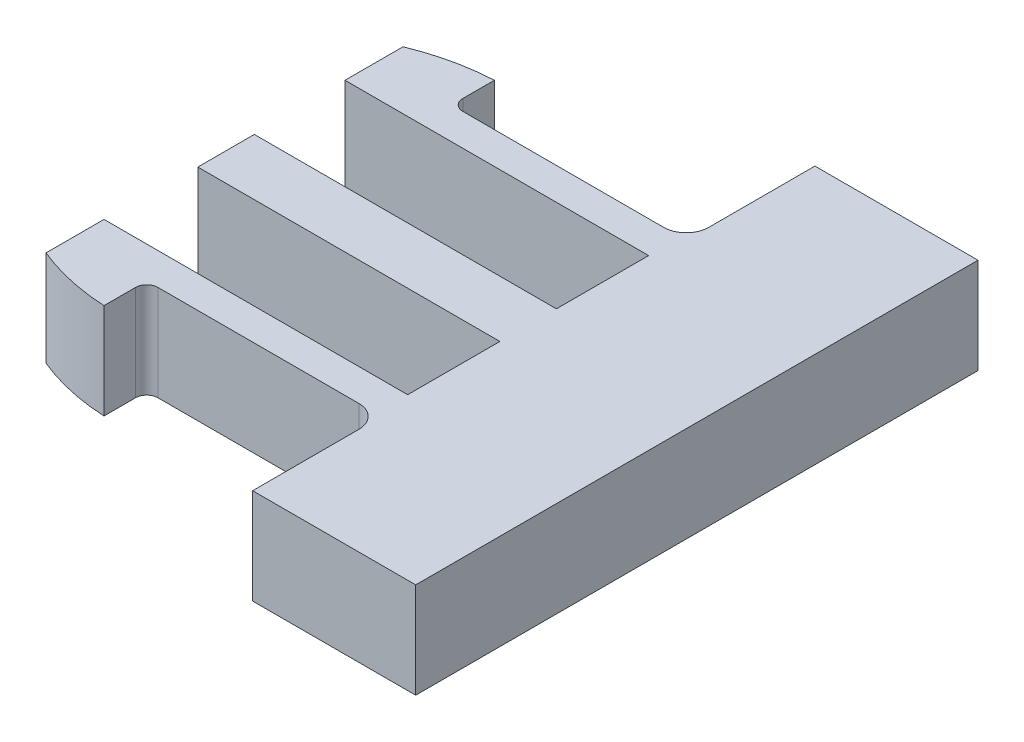
ISO-10303-21;
HEADER;
FILE_DESCRIPTION(('STEP AP214'),'2;1');
FILE_NAME('part.step','',(''),(''),'','','');
FILE_SCHEMA(('AUTOMOTIVE_DESIGN { 1 0 10303 214 1 1 1 1 }'));
ENDSEC;
DATA;
#1=APPLICATION_CONTEXT('core data for automotive mechanical design processes');
#2=APPLICATION_PROTOCOL_DEFINITION('international standard','automotive_design',2000,#1);
#3=PRODUCT_CONTEXT('',#1,'mechanical');
#4=PRODUCT('Part','Part','',(#3));
#5=PRODUCT_RELATED_PRODUCT_CATEGORY('part','',(#4));
#6=PRODUCT_DEFINITION_FORMATION('','',#4);
#7=PRODUCT_DEFINITION_CONTEXT('part definition',#1,'design');
#8=PRODUCT_DEFINITION('design','',#6,#7);
#9=PRODUCT_DEFINITION_SHAPE('','',#8);
#10=(LENGTH_UNIT() NAMED_UNIT(*) SI_UNIT(.MILLI.,.METRE.));
#11=(NAMED_UNIT(*) PLANE_ANGLE_UNIT() SI_UNIT($,.RADIAN.));
#12=(NAMED_UNIT(*) SI_UNIT($,.STERADIAN.) SOLID_ANGLE_UNIT());
#13=UNCERTAINTY_MEASURE_WITH_UNIT(LENGTH_MEASURE(1.E-05),#10,'distance_accuracy_value','');
#14=(GEOMETRIC_REPRESENTATION_CONTEXT(3) GLOBAL_UNCERTAINTY_ASSIGNED_CONTEXT((#13)) GLOBAL_UNIT_ASSIGNED_CONTEXT((#10,
#11,#12)) REPRESENTATION_CONTEXT('',''));
#15=CARTESIAN_POINT('',(0.,0.,0.));
#16=DIRECTION('',(0.,0.,1.));
#17=DIRECTION('',(1.,0.,0.));
#18=AXIS2_PLACEMENT_3D('',#15,#16,#17);
#19=CARTESIAN_POINT('',(0.,8.5,-10.7145111342555));
#20=DIRECTION('',(0.,0.,-1.));
#21=DIRECTION('',(-1.,0.,0.));
#22=AXIS2_PLACEMENT_3D('',#19,#20,#21);
#23=PLANE('',#22);
#24=DIRECTION('',(1.,0.,0.));
#25=VECTOR('',#24,1.);
#26=CARTESIAN_POINT('',(0.,8.5,-10.7145111342555));
#27=LINE('',#26,#25);
#28=CARTESIAN_POINT('',(-13.7298022268936,8.5,-10.7145111342555));
#29=VERTEX_POINT('',#28);
#30=CARTESIAN_POINT('',(13.2701977731064,8.5,-10.7145111342555));
#31=VERTEX_POINT('',#30);
#32=EDGE_CURVE('E330',#29,#31,#27,.T.);
#33=ORIENTED_EDGE('',*,*,#32,.F.);
#34=DIRECTION('',(0.,-1.,0.));
#35=VECTOR('',#34,1.);
#36=CARTESIAN_POINT('',(-13.7298022268936,8.5,-10.7145111342555));
#37=LINE('',#36,#35);
#38=CARTESIAN_POINT('',(-13.7298022268936,0.,-10.7145111342555));
#39=VERTEX_POINT('',#38);
#40=EDGE_CURVE('E265',#29,#39,#37,.T.);
#41=ORIENTED_EDGE('',*,*,#40,.T.);
#42=DIRECTION('',(1.,0.,0.));
#43=VECTOR('',#42,1.);
#44=CARTESIAN_POINT('',(0.,0.,-10.7145111342555));
#45=LINE('',#44,#43);
#46=CARTESIAN_POINT('',(13.2701977731064,0.,-10.7145111342555));
#47=VERTEX_POINT('',#46);
#48=EDGE_CURVE('E324',#39,#47,#45,.T.);
#49=ORIENTED_EDGE('',*,*,#48,.T.);
#50=DIRECTION('',(0.,-1.,0.));
#51=VECTOR('',#50,1.);
#52=CARTESIAN_POINT('',(13.2701977731064,8.5,-10.7145111342555));
#53=LINE('',#52,#51);
#54=EDGE_CURVE('E376',#31,#47,#53,.T.);
#55=ORIENTED_EDGE('',*,*,#54,.F.);
#56=EDGE_LOOP('',(#33,#41,#49,#55));
#57=FACE_BOUND('',#56,.T.);
#58=ADVANCED_FACE('F47',(#57),#23,.F.);
#59=CARTESIAN_POINT('',(13.2701977731064,8.5,0.));
#60=DIRECTION('',(1.,0.,0.));
#61=DIRECTION('',(0.,0.,-1.));
#62=AXIS2_PLACEMENT_3D('',#59,#60,#61);
#63=PLANE('',#62);
#64=DIRECTION('',(0.,0.,1.));
#65=VECTOR('',#64,1.);
#66=CARTESIAN_POINT('',(13.2701977731064,0.,0.));
#67=LINE('',#66,#65);
#68=CARTESIAN_POINT('',(13.2701977731064,0.,-2.51223546642367));
#69=VERTEX_POINT('',#68);
#70=EDGE_CURVE('E357',#47,#69,#67,.T.);
#71=ORIENTED_EDGE('',*,*,#70,.T.);
#72=DIRECTION('',(0.,1.,0.));
#73=VECTOR('',#72,1.);
#74=CARTESIAN_POINT('',(13.2701977731064,-1.5,-2.51223546642367));
#75=LINE('',#74,#73);
#76=CARTESIAN_POINT('',(13.2701977731064,8.5,-2.51223546642367));
#77=VERTEX_POINT('',#76);
#78=EDGE_CURVE('E295',#69,#77,#75,.T.);
#79=ORIENTED_EDGE('',*,*,#78,.T.);
#80=DIRECTION('',(0.,0.,1.));
#81=VECTOR('',#80,1.);
#82=CARTESIAN_POINT('',(13.2701977731064,8.5,0.));
#83=LINE('',#82,#81);
#84=EDGE_CURVE('E333',#31,#77,#83,.T.);
#85=ORIENTED_EDGE('',*,*,#84,.F.);
#86=ORIENTED_EDGE('',*,*,#54,.T.);
#87=EDGE_LOOP('',(#71,#79,#85,#86));
#88=FACE_BOUND('',#87,.T.);
#89=ADVANCED_FACE('F497',(#88),#63,.F.);
#90=CARTESIAN_POINT('',(13.2701977731064,8.5,0.));
#91=DIRECTION('',(1.,0.,0.));
#92=DIRECTION('',(0.,0.,-1.));
#93=AXIS2_PLACEMENT_3D('',#90,#91,#92);
#94=PLANE('',#93);
#95=DIRECTION('',(0.,0.,1.));
#96=VECTOR('',#95,1.);
#97=CARTESIAN_POINT('',(13.2701977731064,0.,0.));
#98=LINE('',#97,#96);
#99=CARTESIAN_POINT('',(13.2701977731064,0.,2.51223546642366));
#100=VERTEX_POINT('',#99);
#101=CARTESIAN_POINT('',(13.2701977731064,0.,10.7145111342555));
#102=VERTEX_POINT('',#101);
#103=EDGE_CURVE('E360',#100,#102,#98,.T.);
#104=ORIENTED_EDGE('',*,*,#103,.T.);
#105=DIRECTION('',(0.,-1.,0.));
#106=VECTOR('',#105,1.);
#107=CARTESIAN_POINT('',(13.2701977731064,8.5,10.7145111342555));
#108=LINE('',#107,#106);
#109=CARTESIAN_POINT('',(13.2701977731064,8.5,10.7145111342555));
#110=VERTEX_POINT('',#109);
#111=EDGE_CURVE('E354',#110,#102,#108,.T.);
#112=ORIENTED_EDGE('',*,*,#111,.F.);
#113=DIRECTION('',(0.,0.,1.));
#114=VECTOR('',#113,1.);
#115=CARTESIAN_POINT('',(13.2701977731064,8.5,0.));
#116=LINE('',#115,#114);
#117=CARTESIAN_POINT('',(13.2701977731064,8.5,2.51223546642366));
#118=VERTEX_POINT('',#117);
#119=EDGE_CURVE('E336',#118,#110,#116,.T.);
#120=ORIENTED_EDGE('',*,*,#119,.F.);
#121=DIRECTION('',(0.,1.,0.));
#122=VECTOR('',#121,1.);
#123=CARTESIAN_POINT('',(13.2701977731064,-1.5,2.51223546642366));
#124=LINE('',#123,#122);
#125=EDGE_CURVE('E294',#100,#118,#124,.T.);
#126=ORIENTED_EDGE('',*,*,#125,.F.);
#127=EDGE_LOOP('',(#104,#112,#120,#126));
#128=FACE_BOUND('',#127,.T.);
#129=ADVANCED_FACE('F515',(#128),#94,.F.);
#130=CARTESIAN_POINT('',(0.,8.5,10.7145111342555));
#131=DIRECTION('',(0.,0.,-1.));
#132=DIRECTION('',(-1.,0.,0.));
#133=AXIS2_PLACEMENT_3D('',#130,#131,#132);
#134=PLANE('',#133);
#135=DIRECTION('',(0.,-1.,0.));
#136=VECTOR('',#135,1.);
#137=CARTESIAN_POINT('',(-13.7298022268936,8.5,10.7145111342555));
#138=LINE('',#137,#136);
#139=CARTESIAN_POINT('',(-13.7298022268936,8.5,10.7145111342555));
#140=VERTEX_POINT('',#139);
#141=CARTESIAN_POINT('',(-13.7298022268936,0.,10.7145111342555));
#142=VERTEX_POINT('',#141);
#143=EDGE_CURVE('E272',#140,#142,#138,.T.);
#144=ORIENTED_EDGE('',*,*,#143,.F.);
#145=DIRECTION('',(1.,0.,0.));
#146=VECTOR('',#145,1.);
#147=CARTESIAN_POINT('',(0.,8.5,10.7145111342555));
#148=LINE('',#147,#146);
#149=EDGE_CURVE('E340',#140,#110,#148,.T.);
#150=ORIENTED_EDGE('',*,*,#149,.T.);
#151=ORIENTED_EDGE('',*,*,#111,.T.);
#152=DIRECTION('',(1.,0.,0.));
#153=VECTOR('',#152,1.);
#154=CARTESIAN_POINT('',(0.,0.,10.7145111342555));
#155=LINE('',#154,#153);
#156=EDGE_CURVE('E364',#142,#102,#155,.T.);
#157=ORIENTED_EDGE('',*,*,#156,.F.);
#158=EDGE_LOOP('',(#144,#150,#151,#157));
#159=FACE_BOUND('',#158,.T.);
#160=ADVANCED_FACE('F519',(#159),#134,.T.);
#161=CARTESIAN_POINT('',(-7.09062809531351,8.5,0.));
#162=DIRECTION('',(-1.,0.,0.));
#163=DIRECTION('',(0.,0.,1.));
#164=AXIS2_PLACEMENT_3D('',#161,#162,#163);
#165=PLANE('',#164);
#166=DIRECTION('',(0.,0.,-1.));
#167=VECTOR('',#166,1.);
#168=CARTESIAN_POINT('',(-7.09062809531351,0.,0.));
#169=LINE('',#168,#167);
#170=CARTESIAN_POINT('',(-7.0906280953135,0.,17.3549870247755));
#171=VERTEX_POINT('',#170);
#172=CARTESIAN_POINT('',(-7.09062809531351,0.,14.5549870247755));
#173=VERTEX_POINT('',#172);
#174=EDGE_CURVE('E221',#171,#173,#169,.T.);
#175=ORIENTED_EDGE('',*,*,#174,.T.);
#176=DIRECTION('',(0.,1.,0.));
#177=VECTOR('',#176,1.);
#178=CARTESIAN_POINT('',(-7.09062809531351,8.5,14.5549870247755));
#179=LINE('',#178,#177);
#180=CARTESIAN_POINT('',(-7.09062809531351,8.5,14.5549870247755));
#181=VERTEX_POINT('',#180);
#182=EDGE_CURVE('E400',#173,#181,#179,.T.);
#183=ORIENTED_EDGE('',*,*,#182,.T.);
#184=DIRECTION('',(0.,0.,-1.));
#185=VECTOR('',#184,1.);
#186=CARTESIAN_POINT('',(-7.09062809531351,8.5,0.));
#187=LINE('',#186,#185);
#188=CARTESIAN_POINT('',(-7.0906280953135,8.5,17.3549870247755));
#189=VERTEX_POINT('',#188);
#190=EDGE_CURVE('E343',#189,#181,#187,.T.);
#191=ORIENTED_EDGE('',*,*,#190,.F.);
#192=DIRECTION('',(0.,1.,0.));
#193=VECTOR('',#192,1.);
#194=CARTESIAN_POINT('',(-7.0906280953135,-1.5,17.3549870247755));
#195=LINE('',#194,#193);
#196=EDGE_CURVE('E313',#171,#189,#195,.T.);
#197=ORIENTED_EDGE('',*,*,#196,.F.);
#198=EDGE_LOOP('',(#175,#183,#191,#197));
#199=FACE_BOUND('',#198,.T.);
#200=ADVANCED_FACE('F530',(#199),#165,.F.);
#201=CARTESIAN_POINT('',(28.2701977731064,8.5,0.));
#202=DIRECTION('',(1.,0.,0.));
#203=DIRECTION('',(0.,0.,-1.));
#204=AXIS2_PLACEMENT_3D('',#201,#202,#203);
#205=PLANE('',#204);
#206=DIRECTION('',(0.,0.,1.));
#207=VECTOR('',#206,1.);
#208=CARTESIAN_POINT('',(28.2701977731064,0.,0.));
#209=LINE('',#208,#207);
#210=CARTESIAN_POINT('',(28.2701977731064,0.,-25.));
#211=VERTEX_POINT('',#210);
#212=CARTESIAN_POINT('',(28.2701977731064,0.,25.));
#213=VERTEX_POINT('',#212);
#214=EDGE_CURVE('E208',#211,#213,#209,.T.);
#215=ORIENTED_EDGE('',*,*,#214,.F.);
#216=DIRECTION('',(0.,1.,0.));
#217=VECTOR('',#216,1.);
#218=CARTESIAN_POINT('',(28.2701977731064,0.,-25.));
#219=LINE('',#218,#217);
#220=CARTESIAN_POINT('',(28.2701977731064,8.5,-25.));
#221=VERTEX_POINT('',#220);
#222=EDGE_CURVE('E211',#211,#221,#219,.T.);
#223=ORIENTED_EDGE('',*,*,#222,.T.);
#224=DIRECTION('',(0.,0.,1.));
#225=VECTOR('',#224,1.);
#226=CARTESIAN_POINT('',(28.2701977731064,8.5,0.));
#227=LINE('',#226,#225);
#228=CARTESIAN_POINT('',(28.2701977731064,8.5,25.));
#229=VERTEX_POINT('',#228);
#230=EDGE_CURVE('E347',#221,#229,#227,.T.);
#231=ORIENTED_EDGE('',*,*,#230,.T.);
#232=DIRECTION('',(0.,1.,0.));
#233=VECTOR('',#232,1.);
#234=CARTESIAN_POINT('',(28.2701977731064,0.,25.));
#235=LINE('',#234,#233);
#236=EDGE_CURVE('E214',#213,#229,#235,.T.);
#237=ORIENTED_EDGE('',*,*,#236,.F.);
#238=EDGE_LOOP('',(#215,#223,#231,#237));
#239=FACE_BOUND('',#238,.T.);
#240=ADVANCED_FACE('F210',(#239),#205,.T.);
#241=CARTESIAN_POINT('',(-7.09062809531351,8.5,0.));
#242=DIRECTION('',(-1.,0.,0.));
#243=DIRECTION('',(0.,0.,1.));
#244=AXIS2_PLACEMENT_3D('',#241,#242,#243);
#245=PLANE('',#244);
#246=DIRECTION('',(0.,0.,-1.));
#247=VECTOR('',#246,1.);
#248=CARTESIAN_POINT('',(-7.09062809531351,8.5,0.));
#249=LINE('',#248,#247);
#250=CARTESIAN_POINT('',(-7.09062809531351,8.5,-14.5549870247755));
#251=VERTEX_POINT('',#250);
#252=CARTESIAN_POINT('',(-7.09062809531351,8.5,-17.3549870247755));
#253=VERTEX_POINT('',#252);
#254=EDGE_CURVE('E350',#251,#253,#249,.T.);
#255=ORIENTED_EDGE('',*,*,#254,.F.);
#256=DIRECTION('',(0.,1.,0.));
#257=VECTOR('',#256,1.);
#258=CARTESIAN_POINT('',(-7.09062809531351,0.,-14.5549870247755));
#259=LINE('',#258,#257);
#260=CARTESIAN_POINT('',(-7.09062809531351,0.,-14.5549870247755));
#261=VERTEX_POINT('',#260);
#262=EDGE_CURVE('E397',#251,#261,#259,.F.);
#263=ORIENTED_EDGE('',*,*,#262,.T.);
#264=DIRECTION('',(0.,0.,-1.));
#265=VECTOR('',#264,1.);
#266=CARTESIAN_POINT('',(-7.09062809531351,0.,0.));
#267=LINE('',#266,#265);
#268=CARTESIAN_POINT('',(-7.09062809531351,0.,-17.3549870247755));
#269=VERTEX_POINT('',#268);
#270=EDGE_CURVE('E220',#261,#269,#267,.T.);
#271=ORIENTED_EDGE('',*,*,#270,.T.);
#272=DIRECTION('',(0.,1.,0.));
#273=VECTOR('',#272,1.);
#274=CARTESIAN_POINT('',(-7.09062809531351,-1.5,-17.3549870247755));
#275=LINE('',#274,#273);
#276=EDGE_CURVE('E319',#269,#253,#275,.T.);
#277=ORIENTED_EDGE('',*,*,#276,.T.);
#278=EDGE_LOOP('',(#255,#263,#271,#277));
#279=FACE_BOUND('',#278,.T.);
#280=ADVANCED_FACE('F484',(#279),#245,.F.);
#281=CARTESIAN_POINT('',(0.,8.5,0.));
#282=DIRECTION('',(0.,1.,0.));
#283=DIRECTION('',(0.,0.,1.));
#284=AXIS2_PLACEMENT_3D('',#281,#282,#283);
#285=PLANE('',#284);
#286=DIRECTION('',(0.,0.,-1.));
#287=VECTOR('',#286,1.);
#288=CARTESIAN_POINT('',(-13.7298022268936,8.5,-25.));
#289=LINE('',#288,#287);
#290=CARTESIAN_POINT('',(-13.7298022268936,8.5,15.8732367944539));
#291=VERTEX_POINT('',#290);
#292=EDGE_CURVE('E260',#291,#140,#289,.T.);
#293=ORIENTED_EDGE('',*,*,#292,.F.);
#294=CARTESIAN_POINT('',(-6.11719769757247,8.5,-2.62130976068387));
#295=DIRECTION('',(0.,-1.,0.));
#296=DIRECTION('',(0.,0.,1.));
#297=AXIS2_PLACEMENT_3D('',#294,#295,#296);
#298=CIRCLE('',#297,20.);
#299=EDGE_CURVE('E320',#189,#291,#298,.T.);
#300=ORIENTED_EDGE('',*,*,#299,.F.);
#301=ORIENTED_EDGE('',*,*,#190,.T.);
#302=CARTESIAN_POINT('',(-6.09062809531351,8.5,14.5549870247755));
#303=DIRECTION('',(0.,1.,0.));
#304=DIRECTION('',(0.,0.,1.));
#305=AXIS2_PLACEMENT_3D('',#302,#303,#304);
#306=CIRCLE('',#305,1.);
#307=CARTESIAN_POINT('',(-6.09062809531351,8.5,13.5549870247755));
#308=VERTEX_POINT('',#307);
#309=EDGE_CURVE('E414',#181,#308,#306,.F.);
#310=ORIENTED_EDGE('',*,*,#309,.T.);
#311=DIRECTION('',(-1.,0.,0.));
#312=VECTOR('',#311,1.);
#313=CARTESIAN_POINT('',(-7.09062809531351,8.5,13.5549870247755));
#314=LINE('',#313,#312);
#315=CARTESIAN_POINT('',(11.7701977731063,8.5,13.5549870247755));
#316=VERTEX_POINT('',#315);
#317=EDGE_CURVE('E299',#316,#308,#314,.T.);
#318=ORIENTED_EDGE('',*,*,#317,.F.);
#319=CARTESIAN_POINT('',(11.7701977731063,8.5,15.5549870247755));
#320=DIRECTION('',(0.,1.,0.));
#321=DIRECTION('',(0.,0.,1.));
#322=AXIS2_PLACEMENT_3D('',#319,#320,#321);
#323=CIRCLE('',#322,2.);
#324=CARTESIAN_POINT('',(13.7701977731063,8.5,15.5549870247755));
#325=VERTEX_POINT('',#324);
#326=EDGE_CURVE('E453',#316,#325,#323,.F.);
#327=ORIENTED_EDGE('',*,*,#326,.T.);
#328=DIRECTION('',(0.,0.,-1.));
#329=VECTOR('',#328,1.);
#330=CARTESIAN_POINT('',(13.7701977731063,8.5,13.5549870247756));
#331=LINE('',#330,#329);
#332=CARTESIAN_POINT('',(13.7701977731064,8.5,25.));
#333=VERTEX_POINT('',#332);
#334=EDGE_CURVE('E275',#333,#325,#331,.T.);
#335=ORIENTED_EDGE('',*,*,#334,.F.);
#336=DIRECTION('',(1.,0.,0.));
#337=VECTOR('',#336,1.);
#338=CARTESIAN_POINT('',(13.7701977731064,8.5,25.));
#339=LINE('',#338,#337);
#340=EDGE_CURVE('E241',#333,#229,#339,.T.);
#341=ORIENTED_EDGE('',*,*,#340,.T.);
#342=ORIENTED_EDGE('',*,*,#230,.F.);
#343=DIRECTION('',(-1.,0.,0.));
#344=VECTOR('',#343,1.);
#345=CARTESIAN_POINT('',(13.7701977731064,8.5,-25.));
#346=LINE('',#345,#344);
#347=CARTESIAN_POINT('',(13.7701977731064,8.5,-25.));
#348=VERTEX_POINT('',#347);
#349=EDGE_CURVE('E229',#221,#348,#346,.T.);
#350=ORIENTED_EDGE('',*,*,#349,.T.);
#351=DIRECTION('',(0.,0.,-1.));
#352=VECTOR('',#351,1.);
#353=CARTESIAN_POINT('',(13.7701977731064,8.5,-24.7145111342555));
#354=LINE('',#353,#352);
#355=CARTESIAN_POINT('',(13.7701977731064,8.5,-15.5549870247755));
#356=VERTEX_POINT('',#355);
#357=EDGE_CURVE('E276',#356,#348,#354,.T.);
#358=ORIENTED_EDGE('',*,*,#357,.F.);
#359=CARTESIAN_POINT('',(11.7701977731064,8.5,-15.5549870247755));
#360=DIRECTION('',(0.,1.,0.));
#361=DIRECTION('',(0.,0.,1.));
#362=AXIS2_PLACEMENT_3D('',#359,#360,#361);
#363=CIRCLE('',#362,2.);
#364=CARTESIAN_POINT('',(11.7701977731064,8.5,-13.5549870247755));
#365=VERTEX_POINT('',#364);
#366=EDGE_CURVE('E459',#356,#365,#363,.F.);
#367=ORIENTED_EDGE('',*,*,#366,.T.);
#368=DIRECTION('',(1.,0.,0.));
#369=VECTOR('',#368,1.);
#370=CARTESIAN_POINT('',(-7.09062809531351,8.5,-13.5549870247755));
#371=LINE('',#370,#369);
#372=CARTESIAN_POINT('',(-6.09062809531351,8.5,-13.5549870247755));
#373=VERTEX_POINT('',#372);
#374=EDGE_CURVE('E309',#373,#365,#371,.T.);
#375=ORIENTED_EDGE('',*,*,#374,.F.);
#376=CARTESIAN_POINT('',(-6.09062809531351,8.5,-14.5549870247755));
#377=DIRECTION('',(0.,1.,0.));
#378=DIRECTION('',(0.,0.,1.));
#379=AXIS2_PLACEMENT_3D('',#376,#377,#378);
#380=CIRCLE('',#379,1.);
#381=EDGE_CURVE('E408',#373,#251,#380,.F.);
#382=ORIENTED_EDGE('',*,*,#381,.T.);
#383=ORIENTED_EDGE('',*,*,#254,.T.);
#384=CARTESIAN_POINT('',(-6.11719769757247,8.5,2.62130976068387));
#385=DIRECTION('',(0.,-1.,0.));
#386=DIRECTION('',(0.,0.,-1.));
#387=AXIS2_PLACEMENT_3D('',#384,#385,#386);
#388=CIRCLE('',#387,20.);
#389=CARTESIAN_POINT('',(-13.7298022268936,8.5,-15.8732367944539));
#390=VERTEX_POINT('',#389);
#391=EDGE_CURVE('E316',#390,#253,#388,.T.);
#392=ORIENTED_EDGE('',*,*,#391,.F.);
#393=EDGE_CURVE('E71',#29,#390,#289,.T.);
#394=ORIENTED_EDGE('',*,*,#393,.F.);
#395=ORIENTED_EDGE('',*,*,#32,.T.);
#396=ORIENTED_EDGE('',*,*,#84,.T.);
#397=DIRECTION('',(1.,0.,0.));
#398=VECTOR('',#397,1.);
#399=CARTESIAN_POINT('',(-13.5906280953135,8.5,-2.51223546642367));
#400=LINE('',#399,#398);
#401=CARTESIAN_POINT('',(-13.5906280953135,8.5,-2.51223546642367));
#402=VERTEX_POINT('',#401);
#403=EDGE_CURVE('E290',#402,#77,#400,.T.);
#404=ORIENTED_EDGE('',*,*,#403,.F.);
#405=DIRECTION('',(0.,0.,-1.));
#406=VECTOR('',#405,1.);
#407=CARTESIAN_POINT('',(-13.5906280953135,8.5,2.51223546642366));
#408=LINE('',#407,#406);
#409=CARTESIAN_POINT('',(-13.5906280953135,8.5,2.51223546642366));
#410=VERTEX_POINT('',#409);
#411=EDGE_CURVE('E286',#410,#402,#408,.T.);
#412=ORIENTED_EDGE('',*,*,#411,.F.);
#413=DIRECTION('',(-1.,0.,0.));
#414=VECTOR('',#413,1.);
#415=CARTESIAN_POINT('',(-13.5906280953135,8.5,2.51223546642366));
#416=LINE('',#415,#414);
#417=EDGE_CURVE('E279',#118,#410,#416,.T.);
#418=ORIENTED_EDGE('',*,*,#417,.F.);
#419=ORIENTED_EDGE('',*,*,#119,.T.);
#420=ORIENTED_EDGE('',*,*,#149,.F.);
#421=EDGE_LOOP('',(#293,#300,#301,#310,#318,#327,#335,#341,#342,#350,#358,#367,#375,#382,#383,
#392,#394,#395,#396,#404,#412,#418,#419,#420));
#422=FACE_BOUND('',#421,.T.);
#423=ADVANCED_FACE('F473',(#422),#285,.T.);
#424=CARTESIAN_POINT('',(0.,0.,0.));
#425=DIRECTION('',(0.,1.,0.));
#426=DIRECTION('',(0.,0.,1.));
#427=AXIS2_PLACEMENT_3D('',#424,#425,#426);
#428=PLANE('',#427);
#429=CARTESIAN_POINT('',(-6.11719769757247,0.,-2.62130976068387));
#430=DIRECTION('',(0.,1.,0.));
#431=DIRECTION('',(0.,0.,1.));
#432=AXIS2_PLACEMENT_3D('',#429,#430,#431);
#433=CIRCLE('',#432,20.);
#434=CARTESIAN_POINT('',(-13.7298022268936,0.,15.8732367944539));
#435=VERTEX_POINT('',#434);
#436=EDGE_CURVE('E380',#171,#435,#433,.F.);
#437=ORIENTED_EDGE('',*,*,#436,.T.);
#438=DIRECTION('',(0.,0.,-1.));
#439=VECTOR('',#438,1.);
#440=CARTESIAN_POINT('',(-13.7298022268936,0.,0.));
#441=LINE('',#440,#439);
#442=EDGE_CURVE('E63',#435,#142,#441,.T.);
#443=ORIENTED_EDGE('',*,*,#442,.T.);
#444=ORIENTED_EDGE('',*,*,#156,.T.);
#445=ORIENTED_EDGE('',*,*,#103,.F.);
#446=DIRECTION('',(-1.,0.,0.));
#447=VECTOR('',#446,1.);
#448=CARTESIAN_POINT('',(0.,0.,2.51223546642366));
#449=LINE('',#448,#447);
#450=CARTESIAN_POINT('',(-13.5906280953135,0.,2.51223546642366));
#451=VERTEX_POINT('',#450);
#452=EDGE_CURVE('E421',#100,#451,#449,.T.);
#453=ORIENTED_EDGE('',*,*,#452,.T.);
#454=DIRECTION('',(0.,0.,-1.));
#455=VECTOR('',#454,1.);
#456=CARTESIAN_POINT('',(-13.5906280953135,0.,0.));
#457=LINE('',#456,#455);
#458=CARTESIAN_POINT('',(-13.5906280953135,0.,-2.51223546642367));
#459=VERTEX_POINT('',#458);
#460=EDGE_CURVE('E425',#451,#459,#457,.T.);
#461=ORIENTED_EDGE('',*,*,#460,.T.);
#462=DIRECTION('',(1.,0.,0.));
#463=VECTOR('',#462,1.);
#464=CARTESIAN_POINT('',(0.,0.,-2.51223546642367));
#465=LINE('',#464,#463);
#466=EDGE_CURVE('E429',#459,#69,#465,.T.);
#467=ORIENTED_EDGE('',*,*,#466,.T.);
#468=ORIENTED_EDGE('',*,*,#70,.F.);
#469=ORIENTED_EDGE('',*,*,#48,.F.);
#470=CARTESIAN_POINT('',(-13.7298022268936,0.,-15.8732367944539));
#471=VERTEX_POINT('',#470);
#472=EDGE_CURVE('E261',#39,#471,#441,.T.);
#473=ORIENTED_EDGE('',*,*,#472,.T.);
#474=CARTESIAN_POINT('',(-6.11719769757247,0.,2.62130976068387));
#475=DIRECTION('',(0.,1.,0.));
#476=DIRECTION('',(0.,0.,1.));
#477=AXIS2_PLACEMENT_3D('',#474,#475,#476);
#478=CIRCLE('',#477,20.);
#479=EDGE_CURVE('E383',#471,#269,#478,.F.);
#480=ORIENTED_EDGE('',*,*,#479,.T.);
#481=ORIENTED_EDGE('',*,*,#270,.F.);
#482=CARTESIAN_POINT('',(-6.09062809531351,0.,-14.5549870247755));
#483=DIRECTION('',(0.,1.,0.));
#484=DIRECTION('',(0.,0.,1.));
#485=AXIS2_PLACEMENT_3D('',#482,#483,#484);
#486=CIRCLE('',#485,1.);
#487=CARTESIAN_POINT('',(-6.09062809531351,0.,-13.5549870247755));
#488=VERTEX_POINT('',#487);
#489=EDGE_CURVE('E411',#261,#488,#486,.T.);
#490=ORIENTED_EDGE('',*,*,#489,.T.);
#491=DIRECTION('',(1.,0.,0.));
#492=VECTOR('',#491,1.);
#493=CARTESIAN_POINT('',(0.,0.,-13.5549870247755));
#494=LINE('',#493,#492);
#495=CARTESIAN_POINT('',(11.7701977731064,0.,-13.5549870247755));
#496=VERTEX_POINT('',#495);
#497=EDGE_CURVE('E389',#488,#496,#494,.T.);
#498=ORIENTED_EDGE('',*,*,#497,.T.);
#499=CARTESIAN_POINT('',(11.7701977731064,0.,-15.5549870247755));
#500=DIRECTION('',(0.,1.,0.));
#501=DIRECTION('',(0.,0.,1.));
#502=AXIS2_PLACEMENT_3D('',#499,#500,#501);
#503=CIRCLE('',#502,2.);
#504=CARTESIAN_POINT('',(13.7701977731064,0.,-15.5549870247755));
#505=VERTEX_POINT('',#504);
#506=EDGE_CURVE('E56',#496,#505,#503,.T.);
#507=ORIENTED_EDGE('',*,*,#506,.T.);
#508=DIRECTION('',(0.,0.,-1.));
#509=VECTOR('',#508,1.);
#510=CARTESIAN_POINT('',(13.7701977731064,0.,0.));
#511=LINE('',#510,#509);
#512=CARTESIAN_POINT('',(13.7701977731064,0.,-25.));
#513=VERTEX_POINT('',#512);
#514=EDGE_CURVE('E236',#505,#513,#511,.T.);
#515=ORIENTED_EDGE('',*,*,#514,.T.);
#516=DIRECTION('',(-1.,0.,0.));
#517=VECTOR('',#516,1.);
#518=CARTESIAN_POINT('',(13.7701977731064,0.,-25.));
#519=LINE('',#518,#517);
#520=EDGE_CURVE('E227',#211,#513,#519,.T.);
#521=ORIENTED_EDGE('',*,*,#520,.F.);
#522=ORIENTED_EDGE('',*,*,#214,.T.);
#523=DIRECTION('',(1.,0.,0.));
#524=VECTOR('',#523,1.);
#525=CARTESIAN_POINT('',(13.7701977731064,0.,25.));
#526=LINE('',#525,#524);
#527=CARTESIAN_POINT('',(13.7701977731064,0.,25.));
#528=VERTEX_POINT('',#527);
#529=EDGE_CURVE('E248',#528,#213,#526,.T.);
#530=ORIENTED_EDGE('',*,*,#529,.F.);
#531=DIRECTION('',(0.,0.,-1.));
#532=VECTOR('',#531,1.);
#533=CARTESIAN_POINT('',(13.7701977731064,0.,0.));
#534=LINE('',#533,#532);
#535=CARTESIAN_POINT('',(13.7701977731063,0.,15.5549870247755));
#536=VERTEX_POINT('',#535);
#537=EDGE_CURVE('E433',#528,#536,#534,.T.);
#538=ORIENTED_EDGE('',*,*,#537,.T.);
#539=CARTESIAN_POINT('',(11.7701977731063,0.,15.5549870247755));
#540=DIRECTION('',(0.,1.,0.));
#541=DIRECTION('',(0.,0.,1.));
#542=AXIS2_PLACEMENT_3D('',#539,#540,#541);
#543=CIRCLE('',#542,2.);
#544=CARTESIAN_POINT('',(11.7701977731063,0.,13.5549870247755));
#545=VERTEX_POINT('',#544);
#546=EDGE_CURVE('E456',#536,#545,#543,.T.);
#547=ORIENTED_EDGE('',*,*,#546,.T.);
#548=DIRECTION('',(-1.,0.,0.));
#549=VECTOR('',#548,1.);
#550=CARTESIAN_POINT('',(0.,0.,13.5549870247755));
#551=LINE('',#550,#549);
#552=CARTESIAN_POINT('',(-6.09062809531351,0.,13.5549870247755));
#553=VERTEX_POINT('',#552);
#554=EDGE_CURVE('E386',#545,#553,#551,.T.);
#555=ORIENTED_EDGE('',*,*,#554,.T.);
#556=CARTESIAN_POINT('',(-6.09062809531351,0.,14.5549870247755));
#557=DIRECTION('',(0.,1.,0.));
#558=DIRECTION('',(0.,0.,1.));
#559=AXIS2_PLACEMENT_3D('',#556,#557,#558);
#560=CIRCLE('',#559,1.);
#561=EDGE_CURVE('E418',#553,#173,#560,.T.);
#562=ORIENTED_EDGE('',*,*,#561,.T.);
#563=ORIENTED_EDGE('',*,*,#174,.F.);
#564=EDGE_LOOP('',(#437,#443,#444,#445,#453,#461,#467,#468,#469,#473,#480,#481,#490,#498,#507,
#515,#521,#522,#530,#538,#547,#555,#562,#563));
#565=FACE_BOUND('',#564,.T.);
#566=ADVANCED_FACE('F234',(#565),#428,.F.);
#567=CARTESIAN_POINT('',(-6.11719769757247,-1.5,-2.62130976068387));
#568=DIRECTION('',(0.,1.,0.));
#569=DIRECTION('',(0.,0.,1.));
#570=AXIS2_PLACEMENT_3D('',#567,#568,#569);
#571=CYLINDRICAL_SURFACE('',#570,20.);
#572=ORIENTED_EDGE('',*,*,#299,.T.);
#573=DIRECTION('',(0.,1.,0.));
#574=VECTOR('',#573,1.);
#575=CARTESIAN_POINT('',(-13.7298022268936,-1.5,15.8732367944539));
#576=LINE('',#575,#574);
#577=EDGE_CURVE('E269',#291,#435,#576,.F.);
#578=ORIENTED_EDGE('',*,*,#577,.T.);
#579=ORIENTED_EDGE('',*,*,#436,.F.);
#580=ORIENTED_EDGE('',*,*,#196,.T.);
#581=EDGE_LOOP('',(#572,#578,#579,#580));
#582=FACE_BOUND('',#581,.T.);
#583=ADVANCED_FACE('F526',(#582),#571,.T.);
#584=CARTESIAN_POINT('',(-6.11719769757247,-1.5,2.62130976068387));
#585=DIRECTION('',(0.,1.,0.));
#586=DIRECTION('',(0.,0.,1.));
#587=AXIS2_PLACEMENT_3D('',#584,#585,#586);
#588=CYLINDRICAL_SURFACE('',#587,20.);
#589=ORIENTED_EDGE('',*,*,#479,.F.);
#590=DIRECTION('',(0.,1.,0.));
#591=VECTOR('',#590,1.);
#592=CARTESIAN_POINT('',(-13.7298022268936,-1.5,-15.8732367944539));
#593=LINE('',#592,#591);
#594=EDGE_CURVE('E11',#471,#390,#593,.T.);
#595=ORIENTED_EDGE('',*,*,#594,.T.);
#596=ORIENTED_EDGE('',*,*,#391,.T.);
#597=ORIENTED_EDGE('',*,*,#276,.F.);
#598=EDGE_LOOP('',(#589,#595,#596,#597));
#599=FACE_BOUND('',#598,.T.);
#600=ADVANCED_FACE('F489',(#599),#588,.T.);
#601=CARTESIAN_POINT('',(-7.09062809531351,-1.5,-13.5549870247755));
#602=DIRECTION('',(0.,0.,1.));
#603=DIRECTION('',(1.,0.,0.));
#604=AXIS2_PLACEMENT_3D('',#601,#602,#603);
#605=PLANE('',#604);
#606=ORIENTED_EDGE('',*,*,#374,.T.);
#607=DIRECTION('',(0.,1.,0.));
#608=VECTOR('',#607,1.);
#609=CARTESIAN_POINT('',(11.7701977731064,0.,-13.5549870247755));
#610=LINE('',#609,#608);
#611=EDGE_CURVE('E450',#365,#496,#610,.F.);
#612=ORIENTED_EDGE('',*,*,#611,.T.);
#613=ORIENTED_EDGE('',*,*,#497,.F.);
#614=DIRECTION('',(0.,1.,0.));
#615=VECTOR('',#614,1.);
#616=CARTESIAN_POINT('',(-6.09062809531351,8.5,-13.5549870247755));
#617=LINE('',#616,#615);
#618=EDGE_CURVE('E393',#488,#373,#617,.T.);
#619=ORIENTED_EDGE('',*,*,#618,.T.);
#620=EDGE_LOOP('',(#606,#612,#613,#619));
#621=FACE_BOUND('',#620,.T.);
#622=ADVANCED_FACE('F475',(#621),#605,.F.);
#623=CARTESIAN_POINT('',(-7.09062809531351,-1.5,13.5549870247755));
#624=DIRECTION('',(0.,0.,-1.));
#625=DIRECTION('',(-1.,0.,0.));
#626=AXIS2_PLACEMENT_3D('',#623,#624,#625);
#627=PLANE('',#626);
#628=ORIENTED_EDGE('',*,*,#554,.F.);
#629=DIRECTION('',(0.,1.,0.));
#630=VECTOR('',#629,1.);
#631=CARTESIAN_POINT('',(11.7701977731063,8.5,13.5549870247755));
#632=LINE('',#631,#630);
#633=EDGE_CURVE('E439',#545,#316,#632,.T.);
#634=ORIENTED_EDGE('',*,*,#633,.T.);
#635=ORIENTED_EDGE('',*,*,#317,.T.);
#636=DIRECTION('',(0.,1.,0.));
#637=VECTOR('',#636,1.);
#638=CARTESIAN_POINT('',(-6.09062809531351,0.,13.5549870247755));
#639=LINE('',#638,#637);
#640=EDGE_CURVE('E404',#308,#553,#639,.F.);
#641=ORIENTED_EDGE('',*,*,#640,.T.);
#642=EDGE_LOOP('',(#628,#634,#635,#641));
#643=FACE_BOUND('',#642,.T.);
#644=ADVANCED_FACE('F539',(#643),#627,.F.);
#645=CARTESIAN_POINT('',(-6.09062809531351,-1.5,-14.5549870247755));
#646=DIRECTION('',(0.,-1.,0.));
#647=DIRECTION('',(0.,0.,-1.));
#648=AXIS2_PLACEMENT_3D('',#645,#646,#647);
#649=CYLINDRICAL_SURFACE('',#648,1.);
#650=ORIENTED_EDGE('',*,*,#489,.F.);
#651=ORIENTED_EDGE('',*,*,#262,.F.);
#652=ORIENTED_EDGE('',*,*,#381,.F.);
#653=ORIENTED_EDGE('',*,*,#618,.F.);
#654=EDGE_LOOP('',(#650,#651,#652,#653));
#655=FACE_BOUND('',#654,.T.);
#656=ADVANCED_FACE('F479',(#655),#649,.F.);
#657=CARTESIAN_POINT('',(-6.09062809531351,8.5,14.5549870247755));
#658=DIRECTION('',(0.,-1.,0.));
#659=DIRECTION('',(0.,0.,-1.));
#660=AXIS2_PLACEMENT_3D('',#657,#658,#659);
#661=CYLINDRICAL_SURFACE('',#660,1.);
#662=ORIENTED_EDGE('',*,*,#561,.F.);
#663=ORIENTED_EDGE('',*,*,#640,.F.);
#664=ORIENTED_EDGE('',*,*,#309,.F.);
#665=ORIENTED_EDGE('',*,*,#182,.F.);
#666=EDGE_LOOP('',(#662,#663,#664,#665));
#667=FACE_BOUND('',#666,.T.);
#668=ADVANCED_FACE('F536',(#667),#661,.F.);
#669=CARTESIAN_POINT('',(-13.5906280953135,-1.5,-2.51223546642367));
#670=DIRECTION('',(0.,0.,1.));
#671=DIRECTION('',(1.,0.,0.));
#672=AXIS2_PLACEMENT_3D('',#669,#670,#671);
#673=PLANE('',#672);
#674=DIRECTION('',(0.,1.,0.));
#675=VECTOR('',#674,1.);
#676=CARTESIAN_POINT('',(-13.5906280953135,-1.5,-2.51223546642367));
#677=LINE('',#676,#675);
#678=EDGE_CURVE('E300',#459,#402,#677,.T.);
#679=ORIENTED_EDGE('',*,*,#678,.T.);
#680=ORIENTED_EDGE('',*,*,#403,.T.);
#681=ORIENTED_EDGE('',*,*,#78,.F.);
#682=ORIENTED_EDGE('',*,*,#466,.F.);
#683=EDGE_LOOP('',(#679,#680,#681,#682));
#684=FACE_BOUND('',#683,.T.);
#685=ADVANCED_FACE('F503',(#684),#673,.F.);
#686=CARTESIAN_POINT('',(-13.5906280953135,-1.5,2.51223546642366));
#687=DIRECTION('',(1.,0.,0.));
#688=DIRECTION('',(0.,0.,-1.));
#689=AXIS2_PLACEMENT_3D('',#686,#687,#688);
#690=PLANE('',#689);
#691=DIRECTION('',(0.,1.,0.));
#692=VECTOR('',#691,1.);
#693=CARTESIAN_POINT('',(-13.5906280953135,-1.5,2.51223546642366));
#694=LINE('',#693,#692);
#695=EDGE_CURVE('E303',#451,#410,#694,.T.);
#696=ORIENTED_EDGE('',*,*,#695,.T.);
#697=ORIENTED_EDGE('',*,*,#411,.T.);
#698=ORIENTED_EDGE('',*,*,#678,.F.);
#699=ORIENTED_EDGE('',*,*,#460,.F.);
#700=EDGE_LOOP('',(#696,#697,#698,#699));
#701=FACE_BOUND('',#700,.T.);
#702=ADVANCED_FACE('F506',(#701),#690,.F.);
#703=CARTESIAN_POINT('',(-13.5906280953135,-1.5,2.51223546642366));
#704=DIRECTION('',(0.,0.,-1.));
#705=DIRECTION('',(-1.,0.,0.));
#706=AXIS2_PLACEMENT_3D('',#703,#704,#705);
#707=PLANE('',#706);
#708=ORIENTED_EDGE('',*,*,#125,.T.);
#709=ORIENTED_EDGE('',*,*,#417,.T.);
#710=ORIENTED_EDGE('',*,*,#695,.F.);
#711=ORIENTED_EDGE('',*,*,#452,.F.);
#712=EDGE_LOOP('',(#708,#709,#710,#711));
#713=FACE_BOUND('',#712,.T.);
#714=ADVANCED_FACE('F510',(#713),#707,.F.);
#715=CARTESIAN_POINT('',(13.7701977731063,-1.5,13.5549870247756));
#716=DIRECTION('',(1.,0.,0.));
#717=DIRECTION('',(0.,0.,-1.));
#718=AXIS2_PLACEMENT_3D('',#715,#716,#717);
#719=PLANE('',#718);
#720=ORIENTED_EDGE('',*,*,#334,.T.);
#721=DIRECTION('',(0.,1.,0.));
#722=VECTOR('',#721,1.);
#723=CARTESIAN_POINT('',(13.7701977731063,0.,15.5549870247755));
#724=LINE('',#723,#722);
#725=EDGE_CURVE('E443',#325,#536,#724,.F.);
#726=ORIENTED_EDGE('',*,*,#725,.T.);
#727=ORIENTED_EDGE('',*,*,#537,.F.);
#728=DIRECTION('',(0.,1.,0.));
#729=VECTOR('',#728,1.);
#730=CARTESIAN_POINT('',(13.7701977731064,0.,25.));
#731=LINE('',#730,#729);
#732=EDGE_CURVE('E249',#528,#333,#731,.T.);
#733=ORIENTED_EDGE('',*,*,#732,.T.);
#734=EDGE_LOOP('',(#720,#726,#727,#733));
#735=FACE_BOUND('',#734,.T.);
#736=ADVANCED_FACE('F546',(#735),#719,.F.);
#737=CARTESIAN_POINT('',(13.7701977731064,-1.5,-24.7145111342555));
#738=DIRECTION('',(1.,0.,0.));
#739=DIRECTION('',(0.,0.,-1.));
#740=AXIS2_PLACEMENT_3D('',#737,#738,#739);
#741=PLANE('',#740);
#742=ORIENTED_EDGE('',*,*,#514,.F.);
#743=DIRECTION('',(0.,1.,0.));
#744=VECTOR('',#743,1.);
#745=CARTESIAN_POINT('',(13.7701977731064,8.5,-15.5549870247755));
#746=LINE('',#745,#744);
#747=EDGE_CURVE('E446',#505,#356,#746,.T.);
#748=ORIENTED_EDGE('',*,*,#747,.T.);
#749=ORIENTED_EDGE('',*,*,#357,.T.);
#750=DIRECTION('',(0.,1.,0.));
#751=VECTOR('',#750,1.);
#752=CARTESIAN_POINT('',(13.7701977731064,0.,-25.));
#753=LINE('',#752,#751);
#754=EDGE_CURVE('E231',#513,#348,#753,.T.);
#755=ORIENTED_EDGE('',*,*,#754,.F.);
#756=EDGE_LOOP('',(#742,#748,#749,#755));
#757=FACE_BOUND('',#756,.T.);
#758=ADVANCED_FACE('F468',(#757),#741,.F.);
#759=CARTESIAN_POINT('',(11.7701977731063,-1.5,15.5549870247755));
#760=DIRECTION('',(0.,-1.,0.));
#761=DIRECTION('',(0.,0.,-1.));
#762=AXIS2_PLACEMENT_3D('',#759,#760,#761);
#763=CYLINDRICAL_SURFACE('',#762,2.);
#764=ORIENTED_EDGE('',*,*,#546,.F.);
#765=ORIENTED_EDGE('',*,*,#725,.F.);
#766=ORIENTED_EDGE('',*,*,#326,.F.);
#767=ORIENTED_EDGE('',*,*,#633,.F.);
#768=EDGE_LOOP('',(#764,#765,#766,#767));
#769=FACE_BOUND('',#768,.T.);
#770=ADVANCED_FACE('F543',(#769),#763,.F.);
#771=CARTESIAN_POINT('',(11.7701977731064,-1.5,-15.5549870247755));
#772=DIRECTION('',(0.,-1.,0.));
#773=DIRECTION('',(0.,0.,-1.));
#774=AXIS2_PLACEMENT_3D('',#771,#772,#773);
#775=CYLINDRICAL_SURFACE('',#774,2.);
#776=ORIENTED_EDGE('',*,*,#506,.F.);
#777=ORIENTED_EDGE('',*,*,#611,.F.);
#778=ORIENTED_EDGE('',*,*,#366,.F.);
#779=ORIENTED_EDGE('',*,*,#747,.F.);
#780=EDGE_LOOP('',(#776,#777,#778,#779));
#781=FACE_BOUND('',#780,.T.);
#782=ADVANCED_FACE('F49',(#781),#775,.F.);
#783=CARTESIAN_POINT('',(-13.7298022268936,-1.5,-25.));
#784=DIRECTION('',(1.,0.,0.));
#785=DIRECTION('',(0.,0.,-1.));
#786=AXIS2_PLACEMENT_3D('',#783,#784,#785);
#787=PLANE('',#786);
#788=ORIENTED_EDGE('',*,*,#393,.T.);
#789=ORIENTED_EDGE('',*,*,#594,.F.);
#790=ORIENTED_EDGE('',*,*,#472,.F.);
#791=ORIENTED_EDGE('',*,*,#40,.F.);
#792=EDGE_LOOP('',(#788,#789,#790,#791));
#793=FACE_BOUND('',#792,.T.);
#794=ADVANCED_FACE('F575',(#793),#787,.F.);
#795=ORIENTED_EDGE('',*,*,#143,.T.);
#796=ORIENTED_EDGE('',*,*,#442,.F.);
#797=ORIENTED_EDGE('',*,*,#577,.F.);
#798=ORIENTED_EDGE('',*,*,#292,.T.);
#799=EDGE_LOOP('',(#795,#796,#797,#798));
#800=FACE_BOUND('',#799,.T.);
#801=ADVANCED_FACE('F520',(#800),#787,.F.);
#802=CARTESIAN_POINT('',(13.7701977731064,0.,-25.));
#803=DIRECTION('',(0.,0.,-1.));
#804=DIRECTION('',(-1.,0.,0.));
#805=AXIS2_PLACEMENT_3D('',#802,#803,#804);
#806=PLANE('',#805);
#807=ORIENTED_EDGE('',*,*,#349,.F.);
#808=ORIENTED_EDGE('',*,*,#222,.F.);
#809=ORIENTED_EDGE('',*,*,#520,.T.);
#810=ORIENTED_EDGE('',*,*,#754,.T.);
#811=EDGE_LOOP('',(#807,#808,#809,#810));
#812=FACE_BOUND('',#811,.T.);
#813=ADVANCED_FACE('F225',(#812),#806,.T.);
#814=CARTESIAN_POINT('',(13.7701977731064,0.,25.));
#815=DIRECTION('',(0.,0.,1.));
#816=DIRECTION('',(1.,0.,0.));
#817=AXIS2_PLACEMENT_3D('',#814,#815,#816);
#818=PLANE('',#817);
#819=ORIENTED_EDGE('',*,*,#340,.F.);
#820=ORIENTED_EDGE('',*,*,#732,.F.);
#821=ORIENTED_EDGE('',*,*,#529,.T.);
#822=ORIENTED_EDGE('',*,*,#236,.T.);
#823=EDGE_LOOP('',(#819,#820,#821,#822));
#824=FACE_BOUND('',#823,.T.);
#825=ADVANCED_FACE('F550',(#824),#818,.T.);
#826=CLOSED_SHELL('',(#58,#89,#129,#160,#200,#240,#280,#423,#566,#583,#600,#622,#644,#656,#668,
#685,#702,#714,#736,#758,#770,#782,#794,#801,#813,#825));
#827=MANIFOLD_SOLID_BREP('B2',#826);
#828=ADVANCED_BREP_SHAPE_REPRESENTATION('',(#18,#827),#14);
#829=SHAPE_DEFINITION_REPRESENTATION(#9,#828);
ENDSEC;
END-ISO-10303-21;
